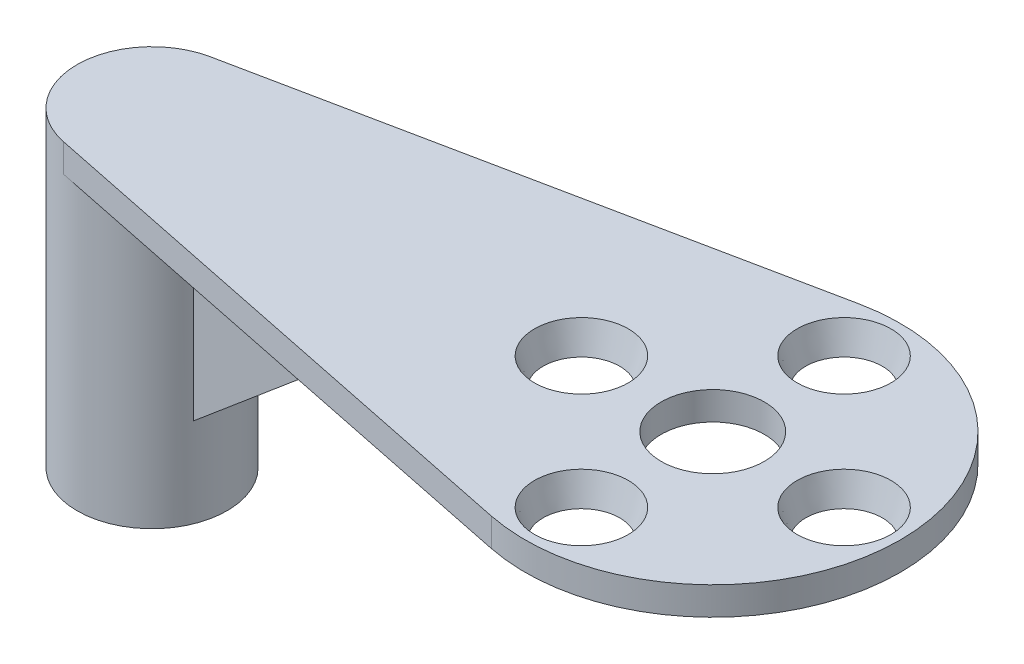
ISO-10303-21;
HEADER;
FILE_DESCRIPTION(('STEP AP214'),'2;1');
FILE_NAME('part.step','',(''),(''),'','','');
FILE_SCHEMA(('AUTOMOTIVE_DESIGN { 1 0 10303 214 1 1 1 1 }'));
ENDSEC;
DATA;
#1=APPLICATION_CONTEXT('core data for automotive mechanical design processes');
#2=APPLICATION_PROTOCOL_DEFINITION('international standard','automotive_design',2000,#1);
#3=PRODUCT_CONTEXT('',#1,'mechanical');
#4=PRODUCT('Part','Part','',(#3));
#5=PRODUCT_RELATED_PRODUCT_CATEGORY('part','',(#4));
#6=PRODUCT_DEFINITION_FORMATION('','',#4);
#7=PRODUCT_DEFINITION_CONTEXT('part definition',#1,'design');
#8=PRODUCT_DEFINITION('design','',#6,#7);
#9=PRODUCT_DEFINITION_SHAPE('','',#8);
#10=(LENGTH_UNIT() NAMED_UNIT(*) SI_UNIT(.MILLI.,.METRE.));
#11=(NAMED_UNIT(*) PLANE_ANGLE_UNIT() SI_UNIT($,.RADIAN.));
#12=(NAMED_UNIT(*) SI_UNIT($,.STERADIAN.) SOLID_ANGLE_UNIT());
#13=UNCERTAINTY_MEASURE_WITH_UNIT(LENGTH_MEASURE(1.E-05),#10,'distance_accuracy_value','');
#14=(GEOMETRIC_REPRESENTATION_CONTEXT(3) GLOBAL_UNCERTAINTY_ASSIGNED_CONTEXT((#13)) GLOBAL_UNIT_ASSIGNED_CONTEXT((#10,
#11,#12)) REPRESENTATION_CONTEXT('',''));
#15=CARTESIAN_POINT('',(0.,0.,0.));
#16=DIRECTION('',(0.,0.,1.));
#17=DIRECTION('',(1.,0.,0.));
#18=AXIS2_PLACEMENT_3D('',#15,#16,#17);
#19=CARTESIAN_POINT('',(0.,1.5,0.));
#20=DIRECTION('',(0.,1.,0.));
#21=DIRECTION('',(0.,0.,1.));
#22=AXIS2_PLACEMENT_3D('',#19,#20,#21);
#23=PLANE('',#22);
#24=CARTESIAN_POINT('',(0.,1.5,0.));
#25=DIRECTION('',(0.,1.,0.));
#26=DIRECTION('',(0.,0.,1.));
#27=AXIS2_PLACEMENT_3D('',#24,#25,#26);
#28=CIRCLE('',#27,4.);
#29=CARTESIAN_POINT('',(-0.802944128471061,1.5,-3.91858146866361));
#30=VERTEX_POINT('',#29);
#31=CARTESIAN_POINT('',(-0.80294412847106,1.5,3.91858146866361));
#32=VERTEX_POINT('',#31);
#33=EDGE_CURVE('E181',#30,#32,#28,.T.);
#34=ORIENTED_EDGE('',*,*,#33,.T.);
#35=DIRECTION('',(0.979645367165902,0.,0.200736032117765));
#36=VECTOR('',#35,1.);
#37=CARTESIAN_POINT('',(-0.80294412847106,1.5,3.91858146866361));
#38=LINE('',#37,#36);
#39=CARTESIAN_POINT('',(27.8826396788224,1.5,9.79645367165902));
#40=VERTEX_POINT('',#39);
#41=EDGE_CURVE('E182',#32,#40,#38,.T.);
#42=ORIENTED_EDGE('',*,*,#41,.T.);
#43=CARTESIAN_POINT('',(29.89,1.5,0.));
#44=DIRECTION('',(0.,1.,0.));
#45=DIRECTION('',(0.,0.,1.));
#46=AXIS2_PLACEMENT_3D('',#43,#44,#45);
#47=CIRCLE('',#46,10.);
#48=CARTESIAN_POINT('',(27.8826396788224,1.5,-9.79645367165902));
#49=VERTEX_POINT('',#48);
#50=EDGE_CURVE('E187',#40,#49,#47,.T.);
#51=ORIENTED_EDGE('',*,*,#50,.T.);
#52=DIRECTION('',(-0.979645367165902,0.,0.200736032117765));
#53=VECTOR('',#52,1.);
#54=CARTESIAN_POINT('',(-0.802944128471061,1.5,-3.91858146866361));
#55=LINE('',#54,#53);
#56=EDGE_CURVE('E189',#49,#30,#55,.T.);
#57=ORIENTED_EDGE('',*,*,#56,.T.);
#58=EDGE_LOOP('',(#34,#42,#51,#57));
#59=FACE_BOUND('',#58,.T.);
#60=CARTESIAN_POINT('',(29.89,1.5,7.));
#61=DIRECTION('',(0.,1.,0.));
#62=DIRECTION('',(0.,0.,1.));
#63=AXIS2_PLACEMENT_3D('',#60,#61,#62);
#64=CIRCLE('',#63,2.5);
#65=CARTESIAN_POINT('',(29.89,1.5,9.5));
#66=VERTEX_POINT('',#65);
#67=EDGE_CURVE('E134',#66,#66,#64,.T.);
#68=ORIENTED_EDGE('',*,*,#67,.F.);
#69=EDGE_LOOP('',(#68));
#70=FACE_BOUND('',#69,.T.);
#71=CARTESIAN_POINT('',(36.89,1.5,0.));
#72=DIRECTION('',(0.,1.,0.));
#73=DIRECTION('',(0.,0.,1.));
#74=AXIS2_PLACEMENT_3D('',#71,#72,#73);
#75=CIRCLE('',#74,2.5);
#76=CARTESIAN_POINT('',(36.89,1.5,2.5));
#77=VERTEX_POINT('',#76);
#78=EDGE_CURVE('E140',#77,#77,#75,.T.);
#79=ORIENTED_EDGE('',*,*,#78,.F.);
#80=EDGE_LOOP('',(#79));
#81=FACE_BOUND('',#80,.T.);
#82=CARTESIAN_POINT('',(29.89,1.5,-7.));
#83=DIRECTION('',(0.,1.,0.));
#84=DIRECTION('',(0.,0.,1.));
#85=AXIS2_PLACEMENT_3D('',#82,#83,#84);
#86=CIRCLE('',#85,2.49999999999999);
#87=CARTESIAN_POINT('',(29.89,1.5,-4.50000000000001));
#88=VERTEX_POINT('',#87);
#89=EDGE_CURVE('E144',#88,#88,#86,.T.);
#90=ORIENTED_EDGE('',*,*,#89,.F.);
#91=EDGE_LOOP('',(#90));
#92=FACE_BOUND('',#91,.T.);
#93=CARTESIAN_POINT('',(22.89,1.5,0.));
#94=DIRECTION('',(0.,1.,0.));
#95=DIRECTION('',(0.,0.,1.));
#96=AXIS2_PLACEMENT_3D('',#93,#94,#95);
#97=CIRCLE('',#96,2.5);
#98=CARTESIAN_POINT('',(22.89,1.5,2.5));
#99=VERTEX_POINT('',#98);
#100=EDGE_CURVE('E149',#99,#99,#97,.T.);
#101=ORIENTED_EDGE('',*,*,#100,.F.);
#102=EDGE_LOOP('',(#101));
#103=FACE_BOUND('',#102,.T.);
#104=CARTESIAN_POINT('',(29.89,1.5,0.));
#105=DIRECTION('',(0.,1.,0.));
#106=DIRECTION('',(0.,0.,1.));
#107=AXIS2_PLACEMENT_3D('',#104,#105,#106);
#108=CIRCLE('',#107,2.74999999999999);
#109=CARTESIAN_POINT('',(29.89,1.5,2.74999999999999));
#110=VERTEX_POINT('',#109);
#111=EDGE_CURVE('E174',#110,#110,#108,.T.);
#112=ORIENTED_EDGE('',*,*,#111,.F.);
#113=EDGE_LOOP('',(#112));
#114=FACE_BOUND('',#113,.T.);
#115=ADVANCED_FACE('F45',(#59,#70,#81,#92,#103,#114),#23,.T.);
#116=CARTESIAN_POINT('',(0.,0.,0.));
#117=DIRECTION('',(0.,1.,0.));
#118=DIRECTION('',(0.,0.,1.));
#119=AXIS2_PLACEMENT_3D('',#116,#117,#118);
#120=PLANE('',#119);
#121=CARTESIAN_POINT('',(29.89,0.,7.));
#122=DIRECTION('',(0.,1.,0.));
#123=DIRECTION('',(0.,0.,1.));
#124=AXIS2_PLACEMENT_3D('',#121,#122,#123);
#125=CIRCLE('',#124,2.04140397781201);
#126=CARTESIAN_POINT('',(29.89,0.,9.04140397781201));
#127=VERTEX_POINT('',#126);
#128=EDGE_CURVE('E137',#127,#127,#125,.T.);
#129=ORIENTED_EDGE('',*,*,#128,.T.);
#130=EDGE_LOOP('',(#129));
#131=FACE_BOUND('',#130,.T.);
#132=CARTESIAN_POINT('',(36.89,0.,0.));
#133=DIRECTION('',(0.,1.,0.));
#134=DIRECTION('',(0.,0.,1.));
#135=AXIS2_PLACEMENT_3D('',#132,#133,#134);
#136=CIRCLE('',#135,2.04140397781201);
#137=CARTESIAN_POINT('',(36.89,0.,2.04140397781201));
#138=VERTEX_POINT('',#137);
#139=EDGE_CURVE('E142',#138,#138,#136,.T.);
#140=ORIENTED_EDGE('',*,*,#139,.T.);
#141=EDGE_LOOP('',(#140));
#142=FACE_BOUND('',#141,.T.);
#143=CARTESIAN_POINT('',(29.89,0.,-7.));
#144=DIRECTION('',(0.,1.,0.));
#145=DIRECTION('',(0.,0.,1.));
#146=AXIS2_PLACEMENT_3D('',#143,#144,#145);
#147=CIRCLE('',#146,2.041403977812);
#148=CARTESIAN_POINT('',(29.89,0.,-4.958596022188));
#149=VERTEX_POINT('',#148);
#150=EDGE_CURVE('E150',#149,#149,#147,.T.);
#151=ORIENTED_EDGE('',*,*,#150,.T.);
#152=EDGE_LOOP('',(#151));
#153=FACE_BOUND('',#152,.T.);
#154=CARTESIAN_POINT('',(22.89,0.,0.));
#155=DIRECTION('',(0.,1.,0.));
#156=DIRECTION('',(0.,0.,1.));
#157=AXIS2_PLACEMENT_3D('',#154,#155,#156);
#158=CIRCLE('',#157,2.04140397781201);
#159=CARTESIAN_POINT('',(22.89,0.,2.04140397781201));
#160=VERTEX_POINT('',#159);
#161=EDGE_CURVE('E135',#160,#160,#158,.T.);
#162=ORIENTED_EDGE('',*,*,#161,.T.);
#163=EDGE_LOOP('',(#162));
#164=FACE_BOUND('',#163,.T.);
#165=CARTESIAN_POINT('',(0.,0.,0.));
#166=DIRECTION('',(0.,-1.,0.));
#167=DIRECTION('',(0.,0.,-1.));
#168=AXIS2_PLACEMENT_3D('',#165,#166,#167);
#169=CIRCLE('',#168,4.);
#170=CARTESIAN_POINT('',(3.70809924354783,0.,1.5));
#171=VERTEX_POINT('',#170);
#172=CARTESIAN_POINT('',(-0.80294412847106,0.,3.91858146866361));
#173=VERTEX_POINT('',#172);
#174=EDGE_CURVE('E107',#171,#173,#169,.T.);
#175=ORIENTED_EDGE('',*,*,#174,.F.);
#176=DIRECTION('',(1.,0.,0.));
#177=VECTOR('',#176,1.);
#178=CARTESIAN_POINT('',(0.,0.,1.5));
#179=LINE('',#178,#177);
#180=CARTESIAN_POINT('',(16.,0.,1.5));
#181=VERTEX_POINT('',#180);
#182=EDGE_CURVE('E60',#171,#181,#179,.T.);
#183=ORIENTED_EDGE('',*,*,#182,.T.);
#184=DIRECTION('',(0.,0.,1.));
#185=VECTOR('',#184,1.);
#186=CARTESIAN_POINT('',(16.,0.,0.));
#187=LINE('',#186,#185);
#188=CARTESIAN_POINT('',(16.,0.,-1.5));
#189=VERTEX_POINT('',#188);
#190=EDGE_CURVE('E61',#181,#189,#187,.F.);
#191=ORIENTED_EDGE('',*,*,#190,.T.);
#192=DIRECTION('',(1.,0.,0.));
#193=VECTOR('',#192,1.);
#194=CARTESIAN_POINT('',(0.,0.,-1.5));
#195=LINE('',#194,#193);
#196=CARTESIAN_POINT('',(3.70809924354783,0.,-1.5));
#197=VERTEX_POINT('',#196);
#198=EDGE_CURVE('E111',#197,#189,#195,.T.);
#199=ORIENTED_EDGE('',*,*,#198,.F.);
#200=CARTESIAN_POINT('',(-0.802944128471061,0.,-3.91858146866361));
#201=VERTEX_POINT('',#200);
#202=EDGE_CURVE('E49',#201,#197,#169,.T.);
#203=ORIENTED_EDGE('',*,*,#202,.F.);
#204=DIRECTION('',(-0.979645367165902,0.,0.200736032117765));
#205=VECTOR('',#204,1.);
#206=CARTESIAN_POINT('',(-0.802944128471061,0.,-3.91858146866361));
#207=LINE('',#206,#205);
#208=CARTESIAN_POINT('',(27.8826396788224,0.,-9.79645367165902));
#209=VERTEX_POINT('',#208);
#210=EDGE_CURVE('E183',#209,#201,#207,.T.);
#211=ORIENTED_EDGE('',*,*,#210,.F.);
#212=CARTESIAN_POINT('',(29.89,0.,0.));
#213=DIRECTION('',(0.,1.,0.));
#214=DIRECTION('',(0.,0.,1.));
#215=AXIS2_PLACEMENT_3D('',#212,#213,#214);
#216=CIRCLE('',#215,10.);
#217=CARTESIAN_POINT('',(27.8826396788224,0.,9.79645367165902));
#218=VERTEX_POINT('',#217);
#219=EDGE_CURVE('E191',#218,#209,#216,.T.);
#220=ORIENTED_EDGE('',*,*,#219,.F.);
#221=DIRECTION('',(0.979645367165902,0.,0.200736032117765));
#222=VECTOR('',#221,1.);
#223=CARTESIAN_POINT('',(-0.80294412847106,0.,3.91858146866361));
#224=LINE('',#223,#222);
#225=EDGE_CURVE('E178',#173,#218,#224,.T.);
#226=ORIENTED_EDGE('',*,*,#225,.F.);
#227=EDGE_LOOP('',(#175,#183,#191,#199,#203,#211,#220,#226));
#228=FACE_BOUND('',#227,.T.);
#229=CARTESIAN_POINT('',(29.89,0.,0.));
#230=DIRECTION('',(0.,1.,0.));
#231=DIRECTION('',(0.,0.,1.));
#232=AXIS2_PLACEMENT_3D('',#229,#230,#231);
#233=CIRCLE('',#232,2.74999999999999);
#234=CARTESIAN_POINT('',(29.89,0.,2.74999999999999));
#235=VERTEX_POINT('',#234);
#236=EDGE_CURVE('E172',#235,#235,#233,.T.);
#237=ORIENTED_EDGE('',*,*,#236,.T.);
#238=EDGE_LOOP('',(#237));
#239=FACE_BOUND('',#238,.T.);
#240=ADVANCED_FACE('F115',(#131,#142,#153,#164,#228,#239),#120,.F.);
#241=CARTESIAN_POINT('',(0.,1.5,0.));
#242=DIRECTION('',(0.,-1.,0.));
#243=DIRECTION('',(0.,0.,-1.));
#244=AXIS2_PLACEMENT_3D('',#241,#242,#243);
#245=CYLINDRICAL_SURFACE('',#244,4.);
#246=CARTESIAN_POINT('',(0.,-15.1,0.));
#247=DIRECTION('',(0.,1.,0.));
#248=DIRECTION('',(0.,0.,1.));
#249=AXIS2_PLACEMENT_3D('',#246,#247,#248);
#250=CIRCLE('',#249,4.);
#251=CARTESIAN_POINT('',(0.,-15.1,4.));
#252=VERTEX_POINT('',#251);
#253=EDGE_CURVE('E169',#252,#252,#250,.T.);
#254=ORIENTED_EDGE('',*,*,#253,.T.);
#255=EDGE_LOOP('',(#254));
#256=FACE_BOUND('',#255,.T.);
#257=DIRECTION('',(0.,-1.,0.));
#258=VECTOR('',#257,1.);
#259=CARTESIAN_POINT('',(-0.80294412847106,1.5,3.91858146866361));
#260=LINE('',#259,#258);
#261=EDGE_CURVE('E198',#32,#173,#260,.T.);
#262=ORIENTED_EDGE('',*,*,#261,.F.);
#263=ORIENTED_EDGE('',*,*,#33,.F.);
#264=DIRECTION('',(0.,-1.,0.));
#265=VECTOR('',#264,1.);
#266=CARTESIAN_POINT('',(-0.802944128471061,1.5,-3.91858146866361));
#267=LINE('',#266,#265);
#268=EDGE_CURVE('E106',#30,#201,#267,.T.);
#269=ORIENTED_EDGE('',*,*,#268,.T.);
#270=ORIENTED_EDGE('',*,*,#202,.T.);
#271=DIRECTION('',(0.,-1.,0.));
#272=VECTOR('',#271,1.);
#273=CARTESIAN_POINT('',(3.70809924354783,1.5,-1.5));
#274=LINE('',#273,#272);
#275=CARTESIAN_POINT('',(3.70809924354783,-10.3456831366806,-1.5));
#276=VERTEX_POINT('',#275);
#277=EDGE_CURVE('E105',#276,#197,#274,.F.);
#278=ORIENTED_EDGE('',*,*,#277,.F.);
#279=CARTESIAN_POINT('',(0.,-13.4666666666667,0.));
#280=DIRECTION('',(-0.643939392127952,0.765076505498557,0.));
#281=DIRECTION('',(-0.765076505498557,-0.643939392127952,0.));
#282=AXIS2_PLACEMENT_3D('',#279,#280,#281);
#283=ELLIPSE('',#282,5.228235308825,4.);
#284=CARTESIAN_POINT('',(3.70809924354783,-10.3456831366806,1.5));
#285=VERTEX_POINT('',#284);
#286=EDGE_CURVE('E128',#276,#285,#283,.F.);
#287=ORIENTED_EDGE('',*,*,#286,.T.);
#288=DIRECTION('',(0.,-1.,0.));
#289=VECTOR('',#288,1.);
#290=CARTESIAN_POINT('',(3.70809924354783,1.5,1.5));
#291=LINE('',#290,#289);
#292=EDGE_CURVE('E120',#285,#171,#291,.F.);
#293=ORIENTED_EDGE('',*,*,#292,.T.);
#294=ORIENTED_EDGE('',*,*,#174,.T.);
#295=EDGE_LOOP('',(#262,#263,#269,#270,#278,#287,#293,#294));
#296=FACE_BOUND('',#295,.T.);
#297=ADVANCED_FACE('F42',(#256,#296),#245,.T.);
#298=CARTESIAN_POINT('',(-0.80294412847106,1.5,3.91858146866361));
#299=DIRECTION('',(0.200736032117765,0.,-0.979645367165902));
#300=DIRECTION('',(-0.979645367165902,0.,-0.200736032117765));
#301=AXIS2_PLACEMENT_3D('',#298,#299,#300);
#302=PLANE('',#301);
#303=ORIENTED_EDGE('',*,*,#225,.T.);
#304=DIRECTION('',(0.,-1.,0.));
#305=VECTOR('',#304,1.);
#306=CARTESIAN_POINT('',(27.8826396788224,1.5,9.79645367165902));
#307=LINE('',#306,#305);
#308=EDGE_CURVE('E199',#40,#218,#307,.T.);
#309=ORIENTED_EDGE('',*,*,#308,.F.);
#310=ORIENTED_EDGE('',*,*,#41,.F.);
#311=ORIENTED_EDGE('',*,*,#261,.T.);
#312=EDGE_LOOP('',(#303,#309,#310,#311));
#313=FACE_BOUND('',#312,.T.);
#314=ADVANCED_FACE('F242',(#313),#302,.F.);
#315=CARTESIAN_POINT('',(29.89,1.5,0.));
#316=DIRECTION('',(0.,-1.,0.));
#317=DIRECTION('',(0.,0.,-1.));
#318=AXIS2_PLACEMENT_3D('',#315,#316,#317);
#319=CYLINDRICAL_SURFACE('',#318,10.);
#320=ORIENTED_EDGE('',*,*,#219,.T.);
#321=DIRECTION('',(0.,-1.,0.));
#322=VECTOR('',#321,1.);
#323=CARTESIAN_POINT('',(27.8826396788224,1.5,-9.79645367165902));
#324=LINE('',#323,#322);
#325=EDGE_CURVE('E194',#49,#209,#324,.T.);
#326=ORIENTED_EDGE('',*,*,#325,.F.);
#327=ORIENTED_EDGE('',*,*,#50,.F.);
#328=ORIENTED_EDGE('',*,*,#308,.T.);
#329=EDGE_LOOP('',(#320,#326,#327,#328));
#330=FACE_BOUND('',#329,.T.);
#331=ADVANCED_FACE('F241',(#330),#319,.T.);
#332=CARTESIAN_POINT('',(-0.802944128471061,1.5,-3.91858146866361));
#333=DIRECTION('',(0.200736032117765,0.,0.979645367165902));
#334=DIRECTION('',(0.979645367165902,0.,-0.200736032117765));
#335=AXIS2_PLACEMENT_3D('',#332,#333,#334);
#336=PLANE('',#335);
#337=ORIENTED_EDGE('',*,*,#210,.T.);
#338=ORIENTED_EDGE('',*,*,#268,.F.);
#339=ORIENTED_EDGE('',*,*,#56,.F.);
#340=ORIENTED_EDGE('',*,*,#325,.T.);
#341=EDGE_LOOP('',(#337,#338,#339,#340));
#342=FACE_BOUND('',#341,.T.);
#343=ADVANCED_FACE('F238',(#342),#336,.F.);
#344=CARTESIAN_POINT('',(29.89,1.5,0.));
#345=DIRECTION('',(0.,-1.,0.));
#346=DIRECTION('',(0.,0.,-1.));
#347=AXIS2_PLACEMENT_3D('',#344,#345,#346);
#348=CYLINDRICAL_SURFACE('',#347,2.74999999999999);
#349=ORIENTED_EDGE('',*,*,#111,.T.);
#350=EDGE_LOOP('',(#349));
#351=FACE_BOUND('',#350,.T.);
#352=ORIENTED_EDGE('',*,*,#236,.F.);
#353=EDGE_LOOP('',(#352));
#354=FACE_BOUND('',#353,.T.);
#355=ADVANCED_FACE('F232',(#351,#354),#348,.F.);
#356=CARTESIAN_POINT('',(0.,-15.1,0.));
#357=DIRECTION('',(0.,1.,0.));
#358=DIRECTION('',(0.,0.,1.));
#359=AXIS2_PLACEMENT_3D('',#356,#357,#358);
#360=PLANE('',#359);
#361=CARTESIAN_POINT('',(0.,-15.1,0.));
#362=DIRECTION('',(0.,-1.,0.));
#363=DIRECTION('',(0.,0.,-1.));
#364=AXIS2_PLACEMENT_3D('',#361,#362,#363);
#365=CIRCLE('',#364,3.1);
#366=CARTESIAN_POINT('',(0.,-15.1,-3.1));
#367=VERTEX_POINT('',#366);
#368=EDGE_CURVE('E164',#367,#367,#365,.T.);
#369=ORIENTED_EDGE('',*,*,#368,.F.);
#370=EDGE_LOOP('',(#369));
#371=FACE_BOUND('',#370,.T.);
#372=ORIENTED_EDGE('',*,*,#253,.F.);
#373=EDGE_LOOP('',(#372));
#374=FACE_BOUND('',#373,.T.);
#375=ADVANCED_FACE('F259',(#371,#374),#360,.F.);
#376=CARTESIAN_POINT('',(0.,-7.23,0.));
#377=DIRECTION('',(0.,-1.,0.));
#378=DIRECTION('',(0.,0.,-1.));
#379=AXIS2_PLACEMENT_3D('',#376,#377,#378);
#380=CYLINDRICAL_SURFACE('',#379,3.1);
#381=CARTESIAN_POINT('',(0.,-14.25,0.));
#382=DIRECTION('',(0.,-1.,0.));
#383=DIRECTION('',(0.,0.,-1.));
#384=AXIS2_PLACEMENT_3D('',#381,#382,#383);
#385=CIRCLE('',#384,3.1);
#386=CARTESIAN_POINT('',(0.,-14.25,-3.1));
#387=VERTEX_POINT('',#386);
#388=EDGE_CURVE('E156',#387,#387,#385,.T.);
#389=ORIENTED_EDGE('',*,*,#388,.F.);
#390=EDGE_LOOP('',(#389));
#391=FACE_BOUND('',#390,.T.);
#392=ORIENTED_EDGE('',*,*,#368,.T.);
#393=EDGE_LOOP('',(#392));
#394=FACE_BOUND('',#393,.T.);
#395=ADVANCED_FACE('F262',(#391,#394),#380,.F.);
#396=CARTESIAN_POINT('',(0.,-14.25,0.));
#397=DIRECTION('',(0.,-1.,0.));
#398=DIRECTION('',(0.,0.,-1.));
#399=AXIS2_PLACEMENT_3D('',#396,#397,#398);
#400=PLANE('',#399);
#401=ORIENTED_EDGE('',*,*,#388,.T.);
#402=EDGE_LOOP('',(#401));
#403=FACE_BOUND('',#402,.T.);
#404=CARTESIAN_POINT('',(0.,-14.25,0.));
#405=DIRECTION('',(0.,-1.,0.));
#406=DIRECTION('',(0.,0.,-1.));
#407=AXIS2_PLACEMENT_3D('',#404,#405,#406);
#408=CIRCLE('',#407,2.5);
#409=CARTESIAN_POINT('',(0.,-14.25,-2.5));
#410=VERTEX_POINT('',#409);
#411=EDGE_CURVE('E138',#410,#410,#408,.T.);
#412=ORIENTED_EDGE('',*,*,#411,.F.);
#413=EDGE_LOOP('',(#412));
#414=FACE_BOUND('',#413,.T.);
#415=ADVANCED_FACE('F267',(#403,#414),#400,.T.);
#416=CARTESIAN_POINT('',(0.,1.53812408671319,0.));
#417=DIRECTION('',(0.,-1.,0.));
#418=DIRECTION('',(0.,0.,-1.));
#419=AXIS2_PLACEMENT_3D('',#416,#417,#418);
#420=CYLINDRICAL_SURFACE('',#419,2.5);
#421=CARTESIAN_POINT('',(0.,-8.08,0.));
#422=DIRECTION('',(0.,-1.,0.));
#423=DIRECTION('',(0.,0.,-1.));
#424=AXIS2_PLACEMENT_3D('',#421,#422,#423);
#425=CIRCLE('',#424,2.5);
#426=CARTESIAN_POINT('',(0.,-8.08,-2.5));
#427=VERTEX_POINT('',#426);
#428=EDGE_CURVE('E162',#427,#427,#425,.F.);
#429=ORIENTED_EDGE('',*,*,#428,.T.);
#430=EDGE_LOOP('',(#429));
#431=FACE_BOUND('',#430,.T.);
#432=ORIENTED_EDGE('',*,*,#411,.T.);
#433=EDGE_LOOP('',(#432));
#434=FACE_BOUND('',#433,.T.);
#435=ADVANCED_FACE('F282',(#431,#434),#420,.F.);
#436=CARTESIAN_POINT('',(0.,-8.08,0.));
#437=DIRECTION('',(0.,-1.,0.));
#438=DIRECTION('',(0.,0.,-1.));
#439=AXIS2_PLACEMENT_3D('',#436,#437,#438);
#440=PLANE('',#439);
#441=ORIENTED_EDGE('',*,*,#428,.F.);
#442=EDGE_LOOP('',(#441));
#443=FACE_BOUND('',#442,.T.);
#444=CARTESIAN_POINT('',(0.,-8.08,0.));
#445=DIRECTION('',(0.,-1.,0.));
#446=DIRECTION('',(0.,0.,-1.));
#447=AXIS2_PLACEMENT_3D('',#444,#445,#446);
#448=CIRCLE('',#447,3.1);
#449=CARTESIAN_POINT('',(0.,-8.08,-3.1));
#450=VERTEX_POINT('',#449);
#451=EDGE_CURVE('E13',#450,#450,#448,.F.);
#452=ORIENTED_EDGE('',*,*,#451,.T.);
#453=EDGE_LOOP('',(#452));
#454=FACE_BOUND('',#453,.T.);
#455=ADVANCED_FACE('F280',(#443,#454),#440,.F.);
#456=CARTESIAN_POINT('',(0.,-7.23,0.));
#457=DIRECTION('',(0.,-1.,0.));
#458=DIRECTION('',(0.,0.,-1.));
#459=AXIS2_PLACEMENT_3D('',#456,#457,#458);
#460=PLANE('',#459);
#461=CARTESIAN_POINT('',(0.,-7.23,0.));
#462=DIRECTION('',(0.,-1.,0.));
#463=DIRECTION('',(0.,0.,-1.));
#464=AXIS2_PLACEMENT_3D('',#461,#462,#463);
#465=CIRCLE('',#464,3.1);
#466=CARTESIAN_POINT('',(0.,-7.23,-3.1));
#467=VERTEX_POINT('',#466);
#468=EDGE_CURVE('E168',#467,#467,#465,.T.);
#469=ORIENTED_EDGE('',*,*,#468,.T.);
#470=EDGE_LOOP('',(#469));
#471=FACE_BOUND('',#470,.T.);
#472=ADVANCED_FACE('F274',(#471),#460,.T.);
#473=ORIENTED_EDGE('',*,*,#468,.F.);
#474=EDGE_LOOP('',(#473));
#475=FACE_BOUND('',#474,.T.);
#476=ORIENTED_EDGE('',*,*,#451,.F.);
#477=EDGE_LOOP('',(#476));
#478=FACE_BOUND('',#477,.T.);
#479=ADVANCED_FACE('F266',(#475,#478),#380,.F.);
#480=CARTESIAN_POINT('',(22.89,1.5,0.));
#481=DIRECTION('',(0.,1.,0.));
#482=DIRECTION('',(0.,0.,1.));
#483=AXIS2_PLACEMENT_3D('',#480,#481,#482);
#484=CONICAL_SURFACE('',#483,2.5,0.296705972839036);
#485=ORIENTED_EDGE('',*,*,#161,.F.);
#486=EDGE_LOOP('',(#485));
#487=FACE_BOUND('',#486,.T.);
#488=ORIENTED_EDGE('',*,*,#100,.T.);
#489=EDGE_LOOP('',(#488));
#490=FACE_BOUND('',#489,.T.);
#491=ADVANCED_FACE('F286',(#487,#490),#484,.F.);
#492=CARTESIAN_POINT('',(29.89,1.5,-7.));
#493=DIRECTION('',(0.,1.,0.));
#494=DIRECTION('',(0.,0.,1.));
#495=AXIS2_PLACEMENT_3D('',#492,#493,#494);
#496=CONICAL_SURFACE('',#495,2.49999999999999,0.296705972839036);
#497=ORIENTED_EDGE('',*,*,#150,.F.);
#498=EDGE_LOOP('',(#497));
#499=FACE_BOUND('',#498,.T.);
#500=ORIENTED_EDGE('',*,*,#89,.T.);
#501=EDGE_LOOP('',(#500));
#502=FACE_BOUND('',#501,.T.);
#503=ADVANCED_FACE('F292',(#499,#502),#496,.F.);
#504=CARTESIAN_POINT('',(36.89,1.5,0.));
#505=DIRECTION('',(0.,1.,0.));
#506=DIRECTION('',(0.,0.,1.));
#507=AXIS2_PLACEMENT_3D('',#504,#505,#506);
#508=CONICAL_SURFACE('',#507,2.5,0.296705972839036);
#509=ORIENTED_EDGE('',*,*,#139,.F.);
#510=EDGE_LOOP('',(#509));
#511=FACE_BOUND('',#510,.T.);
#512=ORIENTED_EDGE('',*,*,#78,.T.);
#513=EDGE_LOOP('',(#512));
#514=FACE_BOUND('',#513,.T.);
#515=ADVANCED_FACE('F222',(#511,#514),#508,.F.);
#516=CARTESIAN_POINT('',(29.89,1.5,7.));
#517=DIRECTION('',(0.,1.,0.));
#518=DIRECTION('',(0.,0.,1.));
#519=AXIS2_PLACEMENT_3D('',#516,#517,#518);
#520=CONICAL_SURFACE('',#519,2.5,0.296705972839036);
#521=ORIENTED_EDGE('',*,*,#128,.F.);
#522=EDGE_LOOP('',(#521));
#523=FACE_BOUND('',#522,.T.);
#524=ORIENTED_EDGE('',*,*,#67,.T.);
#525=EDGE_LOOP('',(#524));
#526=FACE_BOUND('',#525,.T.);
#527=ADVANCED_FACE('F212',(#523,#526),#520,.F.);
#528=CARTESIAN_POINT('',(16.,0.,0.));
#529=DIRECTION('',(-0.643939392127952,0.765076505498557,0.));
#530=DIRECTION('',(-0.765076505498557,-0.643939392127952,0.));
#531=AXIS2_PLACEMENT_3D('',#528,#529,#530);
#532=PLANE('',#531);
#533=ORIENTED_EDGE('',*,*,#190,.F.);
#534=DIRECTION('',(-0.765076505498557,-0.643939392127952,0.));
#535=VECTOR('',#534,1.);
#536=CARTESIAN_POINT('',(16.,0.,1.5));
#537=LINE('',#536,#535);
#538=EDGE_CURVE('E122',#181,#285,#537,.T.);
#539=ORIENTED_EDGE('',*,*,#538,.T.);
#540=ORIENTED_EDGE('',*,*,#286,.F.);
#541=DIRECTION('',(-0.765076505498557,-0.643939392127952,0.));
#542=VECTOR('',#541,1.);
#543=CARTESIAN_POINT('',(16.,0.,-1.5));
#544=LINE('',#543,#542);
#545=EDGE_CURVE('E119',#189,#276,#544,.T.);
#546=ORIENTED_EDGE('',*,*,#545,.F.);
#547=EDGE_LOOP('',(#533,#539,#540,#546));
#548=FACE_BOUND('',#547,.T.);
#549=ADVANCED_FACE('F211',(#548),#532,.F.);
#550=CARTESIAN_POINT('',(17.945,-6.8,1.5));
#551=DIRECTION('',(0.,0.,1.));
#552=DIRECTION('',(1.,0.,0.));
#553=AXIS2_PLACEMENT_3D('',#550,#551,#552);
#554=PLANE('',#553);
#555=ORIENTED_EDGE('',*,*,#182,.F.);
#556=ORIENTED_EDGE('',*,*,#292,.F.);
#557=ORIENTED_EDGE('',*,*,#538,.F.);
#558=EDGE_LOOP('',(#555,#556,#557));
#559=FACE_BOUND('',#558,.T.);
#560=ADVANCED_FACE('F209',(#559),#554,.T.);
#561=CARTESIAN_POINT('',(17.945,-6.8,-1.5));
#562=DIRECTION('',(0.,0.,1.));
#563=DIRECTION('',(1.,0.,0.));
#564=AXIS2_PLACEMENT_3D('',#561,#562,#563);
#565=PLANE('',#564);
#566=ORIENTED_EDGE('',*,*,#277,.T.);
#567=ORIENTED_EDGE('',*,*,#198,.T.);
#568=ORIENTED_EDGE('',*,*,#545,.T.);
#569=EDGE_LOOP('',(#566,#567,#568));
#570=FACE_BOUND('',#569,.T.);
#571=ADVANCED_FACE('F118',(#570),#565,.F.);
#572=CLOSED_SHELL('',(#115,#240,#297,#314,#331,#343,#355,#375,#395,#415,#435,#455,#472,#479,
#491,#503,#515,#527,#549,#560,#571));
#573=MANIFOLD_SOLID_BREP('B2',#572);
#574=ADVANCED_BREP_SHAPE_REPRESENTATION('',(#18,#573),#14);
#575=SHAPE_DEFINITION_REPRESENTATION(#9,#574);
ENDSEC;
END-ISO-10303-21;
